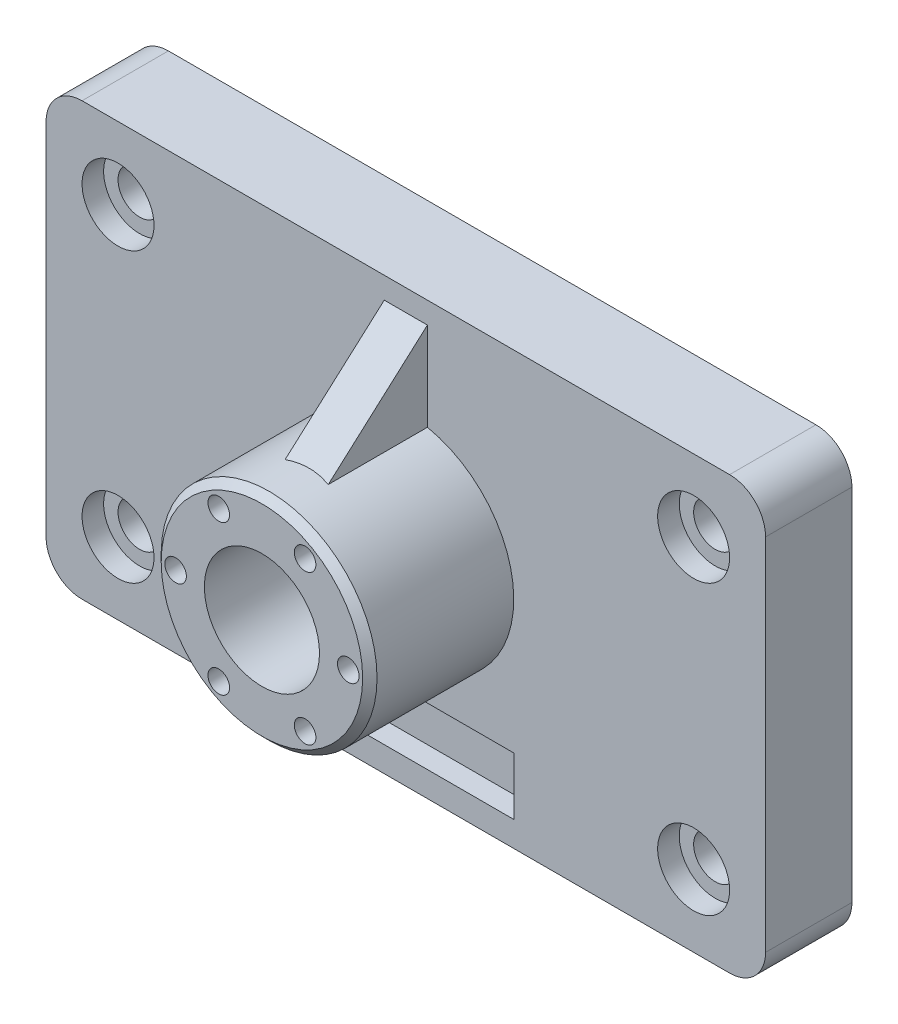
ISO-10303-21;
HEADER;
FILE_DESCRIPTION(('STEP AP214'),'2;1');
FILE_NAME('part.step','',(''),(''),'','','');
FILE_SCHEMA(('AUTOMOTIVE_DESIGN { 1 0 10303 214 1 1 1 1 }'));
ENDSEC;
DATA;
#1=APPLICATION_CONTEXT('core data for automotive mechanical design processes');
#2=APPLICATION_PROTOCOL_DEFINITION('international standard','automotive_design',2000,#1);
#3=PRODUCT_CONTEXT('',#1,'mechanical');
#4=PRODUCT('Part','Part','',(#3));
#5=PRODUCT_RELATED_PRODUCT_CATEGORY('part','',(#4));
#6=PRODUCT_DEFINITION_FORMATION('','',#4);
#7=PRODUCT_DEFINITION_CONTEXT('part definition',#1,'design');
#8=PRODUCT_DEFINITION('design','',#6,#7);
#9=PRODUCT_DEFINITION_SHAPE('','',#8);
#10=(LENGTH_UNIT() NAMED_UNIT(*) SI_UNIT(.MILLI.,.METRE.));
#11=(NAMED_UNIT(*) PLANE_ANGLE_UNIT() SI_UNIT($,.RADIAN.));
#12=(NAMED_UNIT(*) SI_UNIT($,.STERADIAN.) SOLID_ANGLE_UNIT());
#13=UNCERTAINTY_MEASURE_WITH_UNIT(LENGTH_MEASURE(1.E-05),#10,'distance_accuracy_value','');
#14=(GEOMETRIC_REPRESENTATION_CONTEXT(3) GLOBAL_UNCERTAINTY_ASSIGNED_CONTEXT((#13)) GLOBAL_UNIT_ASSIGNED_CONTEXT((#10,
#11,#12)) REPRESENTATION_CONTEXT('',''));
#15=CARTESIAN_POINT('',(0.,0.,0.));
#16=DIRECTION('',(0.,0.,1.));
#17=DIRECTION('',(1.,0.,0.));
#18=AXIS2_PLACEMENT_3D('',#15,#16,#17);
#19=CARTESIAN_POINT('',(-50.,-30.,12.));
#20=DIRECTION('',(1.,0.,0.));
#21=DIRECTION('',(0.,0.,-1.));
#22=AXIS2_PLACEMENT_3D('',#19,#20,#21);
#23=PLANE('',#22);
#24=DIRECTION('',(0.,-1.,0.));
#25=VECTOR('',#24,1.);
#26=CARTESIAN_POINT('',(-50.,-30.,12.));
#27=LINE('',#26,#25);
#28=CARTESIAN_POINT('',(-50.,25.,12.));
#29=VERTEX_POINT('',#28);
#30=CARTESIAN_POINT('',(-50.,-25.,12.));
#31=VERTEX_POINT('',#30);
#32=EDGE_CURVE('E290',#29,#31,#27,.T.);
#33=ORIENTED_EDGE('',*,*,#32,.F.);
#34=DIRECTION('',(0.,0.,-1.));
#35=VECTOR('',#34,1.);
#36=CARTESIAN_POINT('',(-50.,25.,12.));
#37=LINE('',#36,#35);
#38=CARTESIAN_POINT('',(-50.,25.,0.));
#39=VERTEX_POINT('',#38);
#40=EDGE_CURVE('E312',#29,#39,#37,.T.);
#41=ORIENTED_EDGE('',*,*,#40,.T.);
#42=DIRECTION('',(0.,-1.,0.));
#43=VECTOR('',#42,1.);
#44=CARTESIAN_POINT('',(-50.,-30.,0.));
#45=LINE('',#44,#43);
#46=CARTESIAN_POINT('',(-50.,-25.,0.));
#47=VERTEX_POINT('',#46);
#48=EDGE_CURVE('E284',#39,#47,#45,.T.);
#49=ORIENTED_EDGE('',*,*,#48,.T.);
#50=DIRECTION('',(0.,0.,-1.));
#51=VECTOR('',#50,1.);
#52=CARTESIAN_POINT('',(-50.,-25.,12.));
#53=LINE('',#52,#51);
#54=EDGE_CURVE('E302',#47,#31,#53,.F.);
#55=ORIENTED_EDGE('',*,*,#54,.T.);
#56=EDGE_LOOP('',(#33,#41,#49,#55));
#57=FACE_BOUND('',#56,.T.);
#58=ADVANCED_FACE('F41',(#57),#23,.F.);
#59=CARTESIAN_POINT('',(-50.,-30.,12.));
#60=DIRECTION('',(0.,1.,0.));
#61=DIRECTION('',(0.,0.,1.));
#62=AXIS2_PLACEMENT_3D('',#59,#60,#61);
#63=PLANE('',#62);
#64=DIRECTION('',(0.,0.,-1.));
#65=VECTOR('',#64,1.);
#66=CARTESIAN_POINT('',(45.,-30.,12.));
#67=LINE('',#66,#65);
#68=CARTESIAN_POINT('',(45.,-30.,0.));
#69=VERTEX_POINT('',#68);
#70=CARTESIAN_POINT('',(45.,-30.,12.));
#71=VERTEX_POINT('',#70);
#72=EDGE_CURVE('E289',#69,#71,#67,.F.);
#73=ORIENTED_EDGE('',*,*,#72,.T.);
#74=DIRECTION('',(1.,0.,0.));
#75=VECTOR('',#74,1.);
#76=CARTESIAN_POINT('',(-50.,-30.,12.));
#77=LINE('',#76,#75);
#78=CARTESIAN_POINT('',(-45.,-30.,12.));
#79=VERTEX_POINT('',#78);
#80=EDGE_CURVE('E293',#79,#71,#77,.T.);
#81=ORIENTED_EDGE('',*,*,#80,.F.);
#82=DIRECTION('',(0.,0.,-1.));
#83=VECTOR('',#82,1.);
#84=CARTESIAN_POINT('',(-45.,-30.,12.));
#85=LINE('',#84,#83);
#86=CARTESIAN_POINT('',(-45.,-30.,0.));
#87=VERTEX_POINT('',#86);
#88=EDGE_CURVE('E343',#79,#87,#85,.T.);
#89=ORIENTED_EDGE('',*,*,#88,.T.);
#90=DIRECTION('',(1.,0.,0.));
#91=VECTOR('',#90,1.);
#92=CARTESIAN_POINT('',(-50.,-30.,0.));
#93=LINE('',#92,#91);
#94=EDGE_CURVE('E305',#87,#69,#93,.T.);
#95=ORIENTED_EDGE('',*,*,#94,.T.);
#96=EDGE_LOOP('',(#73,#81,#89,#95));
#97=FACE_BOUND('',#96,.T.);
#98=ADVANCED_FACE('F396',(#97),#63,.F.);
#99=CARTESIAN_POINT('',(50.,-30.,12.));
#100=DIRECTION('',(-1.,0.,0.));
#101=DIRECTION('',(0.,0.,1.));
#102=AXIS2_PLACEMENT_3D('',#99,#100,#101);
#103=PLANE('',#102);
#104=DIRECTION('',(0.,1.,0.));
#105=VECTOR('',#104,1.);
#106=CARTESIAN_POINT('',(50.,-30.,0.));
#107=LINE('',#106,#105);
#108=CARTESIAN_POINT('',(50.,-25.,0.));
#109=VERTEX_POINT('',#108);
#110=CARTESIAN_POINT('',(50.,25.,0.));
#111=VERTEX_POINT('',#110);
#112=EDGE_CURVE('E307',#109,#111,#107,.T.);
#113=ORIENTED_EDGE('',*,*,#112,.T.);
#114=DIRECTION('',(0.,0.,-1.));
#115=VECTOR('',#114,1.);
#116=CARTESIAN_POINT('',(50.,25.,12.));
#117=LINE('',#116,#115);
#118=CARTESIAN_POINT('',(50.,25.,12.));
#119=VERTEX_POINT('',#118);
#120=EDGE_CURVE('E341',#111,#119,#117,.F.);
#121=ORIENTED_EDGE('',*,*,#120,.T.);
#122=DIRECTION('',(0.,1.,0.));
#123=VECTOR('',#122,1.);
#124=CARTESIAN_POINT('',(50.,-30.,12.));
#125=LINE('',#124,#123);
#126=CARTESIAN_POINT('',(50.,-25.,12.));
#127=VERTEX_POINT('',#126);
#128=EDGE_CURVE('E296',#127,#119,#125,.T.);
#129=ORIENTED_EDGE('',*,*,#128,.F.);
#130=DIRECTION('',(0.,0.,-1.));
#131=VECTOR('',#130,1.);
#132=CARTESIAN_POINT('',(50.,-25.,12.));
#133=LINE('',#132,#131);
#134=EDGE_CURVE('E338',#127,#109,#133,.T.);
#135=ORIENTED_EDGE('',*,*,#134,.T.);
#136=EDGE_LOOP('',(#113,#121,#129,#135));
#137=FACE_BOUND('',#136,.T.);
#138=ADVANCED_FACE('F403',(#137),#103,.F.);
#139=CARTESIAN_POINT('',(-50.,30.,12.));
#140=DIRECTION('',(0.,-1.,0.));
#141=DIRECTION('',(0.,0.,-1.));
#142=AXIS2_PLACEMENT_3D('',#139,#140,#141);
#143=PLANE('',#142);
#144=DIRECTION('',(-1.,0.,0.));
#145=VECTOR('',#144,1.);
#146=CARTESIAN_POINT('',(-50.,30.,0.));
#147=LINE('',#146,#145);
#148=CARTESIAN_POINT('',(45.,30.,0.));
#149=VERTEX_POINT('',#148);
#150=CARTESIAN_POINT('',(-45.,30.,0.));
#151=VERTEX_POINT('',#150);
#152=EDGE_CURVE('E294',#149,#151,#147,.T.);
#153=ORIENTED_EDGE('',*,*,#152,.T.);
#154=DIRECTION('',(0.,0.,-1.));
#155=VECTOR('',#154,1.);
#156=CARTESIAN_POINT('',(-45.,30.,12.));
#157=LINE('',#156,#155);
#158=CARTESIAN_POINT('',(-45.,30.,12.));
#159=VERTEX_POINT('',#158);
#160=EDGE_CURVE('E328',#151,#159,#157,.F.);
#161=ORIENTED_EDGE('',*,*,#160,.T.);
#162=DIRECTION('',(-1.,0.,0.));
#163=VECTOR('',#162,1.);
#164=CARTESIAN_POINT('',(-50.,30.,12.));
#165=LINE('',#164,#163);
#166=CARTESIAN_POINT('',(45.,30.,12.));
#167=VERTEX_POINT('',#166);
#168=EDGE_CURVE('E299',#167,#159,#165,.T.);
#169=ORIENTED_EDGE('',*,*,#168,.F.);
#170=DIRECTION('',(0.,0.,-1.));
#171=VECTOR('',#170,1.);
#172=CARTESIAN_POINT('',(45.,30.,12.));
#173=LINE('',#172,#171);
#174=EDGE_CURVE('E325',#167,#149,#173,.T.);
#175=ORIENTED_EDGE('',*,*,#174,.T.);
#176=EDGE_LOOP('',(#153,#161,#169,#175));
#177=FACE_BOUND('',#176,.T.);
#178=ADVANCED_FACE('F381',(#177),#143,.F.);
#179=CARTESIAN_POINT('',(0.,0.,12.));
#180=DIRECTION('',(0.,0.,-1.));
#181=DIRECTION('',(-1.,0.,0.));
#182=AXIS2_PLACEMENT_3D('',#179,#180,#181);
#183=PLANE('',#182);
#184=DIRECTION('',(0.,-1.,0.));
#185=VECTOR('',#184,1.);
#186=CARTESIAN_POINT('',(-15.,-18.5,12.));
#187=LINE('',#186,#185);
#188=CARTESIAN_POINT('',(-15.,-18.5,12.));
#189=VERTEX_POINT('',#188);
#190=CARTESIAN_POINT('',(-15.,-26.5,12.));
#191=VERTEX_POINT('',#190);
#192=EDGE_CURVE('E211',#189,#191,#187,.T.);
#193=ORIENTED_EDGE('',*,*,#192,.F.);
#194=DIRECTION('',(-1.,0.,0.));
#195=VECTOR('',#194,1.);
#196=CARTESIAN_POINT('',(15.,-18.5,12.));
#197=LINE('',#196,#195);
#198=CARTESIAN_POINT('',(15.,-18.5,12.));
#199=VERTEX_POINT('',#198);
#200=EDGE_CURVE('E218',#199,#189,#197,.T.);
#201=ORIENTED_EDGE('',*,*,#200,.F.);
#202=DIRECTION('',(0.,1.,0.));
#203=VECTOR('',#202,1.);
#204=CARTESIAN_POINT('',(15.,-26.5,12.));
#205=LINE('',#204,#203);
#206=CARTESIAN_POINT('',(15.,-26.5,12.));
#207=VERTEX_POINT('',#206);
#208=EDGE_CURVE('E229',#207,#199,#205,.T.);
#209=ORIENTED_EDGE('',*,*,#208,.F.);
#210=DIRECTION('',(1.,0.,0.));
#211=VECTOR('',#210,1.);
#212=CARTESIAN_POINT('',(-15.,-26.5,12.));
#213=LINE('',#212,#211);
#214=EDGE_CURVE('E227',#191,#207,#213,.T.);
#215=ORIENTED_EDGE('',*,*,#214,.F.);
#216=EDGE_LOOP('',(#193,#201,#209,#215));
#217=FACE_BOUND('',#216,.T.);
#218=ORIENTED_EDGE('',*,*,#80,.T.);
#219=CARTESIAN_POINT('',(45.,-25.,12.));
#220=DIRECTION('',(0.,0.,-1.));
#221=DIRECTION('',(-1.,0.,0.));
#222=AXIS2_PLACEMENT_3D('',#219,#220,#221);
#223=CIRCLE('',#222,5.);
#224=EDGE_CURVE('E332',#71,#127,#223,.F.);
#225=ORIENTED_EDGE('',*,*,#224,.T.);
#226=ORIENTED_EDGE('',*,*,#128,.T.);
#227=CARTESIAN_POINT('',(45.,25.,12.));
#228=DIRECTION('',(0.,0.,-1.));
#229=DIRECTION('',(-1.,0.,0.));
#230=AXIS2_PLACEMENT_3D('',#227,#228,#229);
#231=CIRCLE('',#230,5.);
#232=EDGE_CURVE('E334',#119,#167,#231,.F.);
#233=ORIENTED_EDGE('',*,*,#232,.T.);
#234=ORIENTED_EDGE('',*,*,#168,.T.);
#235=CARTESIAN_POINT('',(-45.,25.,12.));
#236=DIRECTION('',(0.,0.,-1.));
#237=DIRECTION('',(-1.,0.,0.));
#238=AXIS2_PLACEMENT_3D('',#235,#236,#237);
#239=CIRCLE('',#238,5.);
#240=EDGE_CURVE('E336',#159,#29,#239,.F.);
#241=ORIENTED_EDGE('',*,*,#240,.T.);
#242=ORIENTED_EDGE('',*,*,#32,.T.);
#243=CARTESIAN_POINT('',(-45.,-25.,12.));
#244=DIRECTION('',(0.,0.,-1.));
#245=DIRECTION('',(-1.,0.,0.));
#246=AXIS2_PLACEMENT_3D('',#243,#244,#245);
#247=CIRCLE('',#246,5.);
#248=EDGE_CURVE('E330',#31,#79,#247,.F.);
#249=ORIENTED_EDGE('',*,*,#248,.T.);
#250=EDGE_LOOP('',(#218,#225,#226,#233,#234,#241,#242,#249));
#251=FACE_BOUND('',#250,.T.);
#252=CARTESIAN_POINT('',(-40.,20.,12.));
#253=DIRECTION('',(0.,0.,1.));
#254=DIRECTION('',(1.,0.,0.));
#255=AXIS2_PLACEMENT_3D('',#252,#253,#254);
#256=CIRCLE('',#255,5.);
#257=CARTESIAN_POINT('',(-35.,20.,12.));
#258=VERTEX_POINT('',#257);
#259=EDGE_CURVE('E263',#258,#258,#256,.T.);
#260=ORIENTED_EDGE('',*,*,#259,.F.);
#261=EDGE_LOOP('',(#260));
#262=FACE_BOUND('',#261,.T.);
#263=CARTESIAN_POINT('',(40.,-20.,12.));
#264=DIRECTION('',(0.,0.,1.));
#265=DIRECTION('',(1.,0.,0.));
#266=AXIS2_PLACEMENT_3D('',#263,#264,#265);
#267=CIRCLE('',#266,5.);
#268=CARTESIAN_POINT('',(45.,-20.,12.));
#269=VERTEX_POINT('',#268);
#270=EDGE_CURVE('E270',#269,#269,#267,.T.);
#271=ORIENTED_EDGE('',*,*,#270,.F.);
#272=EDGE_LOOP('',(#271));
#273=FACE_BOUND('',#272,.T.);
#274=CARTESIAN_POINT('',(40.,20.,12.));
#275=DIRECTION('',(0.,0.,1.));
#276=DIRECTION('',(1.,0.,0.));
#277=AXIS2_PLACEMENT_3D('',#274,#275,#276);
#278=CIRCLE('',#277,5.);
#279=CARTESIAN_POINT('',(45.,20.,12.));
#280=VERTEX_POINT('',#279);
#281=EDGE_CURVE('E256',#280,#280,#278,.T.);
#282=ORIENTED_EDGE('',*,*,#281,.F.);
#283=EDGE_LOOP('',(#282));
#284=FACE_BOUND('',#283,.T.);
#285=CARTESIAN_POINT('',(-40.,-20.,12.));
#286=DIRECTION('',(0.,0.,1.));
#287=DIRECTION('',(1.,0.,0.));
#288=AXIS2_PLACEMENT_3D('',#285,#286,#287);
#289=CIRCLE('',#288,5.);
#290=CARTESIAN_POINT('',(-35.,-20.,12.));
#291=VERTEX_POINT('',#290);
#292=EDGE_CURVE('E266',#291,#291,#289,.T.);
#293=ORIENTED_EDGE('',*,*,#292,.F.);
#294=EDGE_LOOP('',(#293));
#295=FACE_BOUND('',#294,.T.);
#296=DIRECTION('',(0.,-1.,0.));
#297=VECTOR('',#296,1.);
#298=CARTESIAN_POINT('',(3.,0.,12.));
#299=LINE('',#298,#297);
#300=CARTESIAN_POINT('',(3.,27.,12.));
#301=VERTEX_POINT('',#300);
#302=CARTESIAN_POINT('',(3.,14.6969384566991,12.));
#303=VERTEX_POINT('',#302);
#304=EDGE_CURVE('E161',#301,#303,#299,.T.);
#305=ORIENTED_EDGE('',*,*,#304,.T.);
#306=CARTESIAN_POINT('',(0.,0.,12.));
#307=DIRECTION('',(0.,0.,1.));
#308=DIRECTION('',(1.,0.,0.));
#309=AXIS2_PLACEMENT_3D('',#306,#307,#308);
#310=CIRCLE('',#309,15.);
#311=CARTESIAN_POINT('',(-3.,14.6969384566991,12.));
#312=VERTEX_POINT('',#311);
#313=EDGE_CURVE('E287',#312,#303,#310,.T.);
#314=ORIENTED_EDGE('',*,*,#313,.F.);
#315=DIRECTION('',(0.,-1.,0.));
#316=VECTOR('',#315,1.);
#317=CARTESIAN_POINT('',(-3.,0.,12.));
#318=LINE('',#317,#316);
#319=CARTESIAN_POINT('',(-3.,27.,12.));
#320=VERTEX_POINT('',#319);
#321=EDGE_CURVE('E64',#320,#312,#318,.T.);
#322=ORIENTED_EDGE('',*,*,#321,.F.);
#323=DIRECTION('',(1.,0.,0.));
#324=VECTOR('',#323,1.);
#325=CARTESIAN_POINT('',(0.,27.,12.));
#326=LINE('',#325,#324);
#327=EDGE_CURVE('E59',#320,#301,#326,.T.);
#328=ORIENTED_EDGE('',*,*,#327,.T.);
#329=EDGE_LOOP('',(#305,#314,#322,#328));
#330=FACE_BOUND('',#329,.T.);
#331=ADVANCED_FACE('F378',(#217,#251,#262,#273,#284,#295,#330),#183,.F.);
#332=CARTESIAN_POINT('',(0.,0.,0.));
#333=DIRECTION('',(0.,0.,-1.));
#334=DIRECTION('',(-1.,0.,0.));
#335=AXIS2_PLACEMENT_3D('',#332,#333,#334);
#336=PLANE('',#335);
#337=CARTESIAN_POINT('',(0.,0.,0.));
#338=DIRECTION('',(0.,0.,1.));
#339=DIRECTION('',(1.,0.,0.));
#340=AXIS2_PLACEMENT_3D('',#337,#338,#339);
#341=CIRCLE('',#340,8.);
#342=CARTESIAN_POINT('',(8.,0.,0.));
#343=VERTEX_POINT('',#342);
#344=EDGE_CURVE('E281',#343,#343,#341,.T.);
#345=ORIENTED_EDGE('',*,*,#344,.T.);
#346=EDGE_LOOP('',(#345));
#347=FACE_BOUND('',#346,.T.);
#348=CARTESIAN_POINT('',(-45.,25.,0.));
#349=DIRECTION('',(0.,0.,-1.));
#350=DIRECTION('',(-1.,0.,0.));
#351=AXIS2_PLACEMENT_3D('',#348,#349,#350);
#352=CIRCLE('',#351,5.);
#353=EDGE_CURVE('E322',#39,#151,#352,.T.);
#354=ORIENTED_EDGE('',*,*,#353,.T.);
#355=ORIENTED_EDGE('',*,*,#152,.F.);
#356=CARTESIAN_POINT('',(45.,25.,0.));
#357=DIRECTION('',(0.,0.,-1.));
#358=DIRECTION('',(-1.,0.,0.));
#359=AXIS2_PLACEMENT_3D('',#356,#357,#358);
#360=CIRCLE('',#359,5.);
#361=EDGE_CURVE('E320',#149,#111,#360,.T.);
#362=ORIENTED_EDGE('',*,*,#361,.T.);
#363=ORIENTED_EDGE('',*,*,#112,.F.);
#364=CARTESIAN_POINT('',(45.,-25.,0.));
#365=DIRECTION('',(0.,0.,-1.));
#366=DIRECTION('',(-1.,0.,0.));
#367=AXIS2_PLACEMENT_3D('',#364,#365,#366);
#368=CIRCLE('',#367,5.);
#369=EDGE_CURVE('E317',#109,#69,#368,.T.);
#370=ORIENTED_EDGE('',*,*,#369,.T.);
#371=ORIENTED_EDGE('',*,*,#94,.F.);
#372=CARTESIAN_POINT('',(-45.,-25.,0.));
#373=DIRECTION('',(0.,0.,-1.));
#374=DIRECTION('',(-1.,0.,0.));
#375=AXIS2_PLACEMENT_3D('',#372,#373,#374);
#376=CIRCLE('',#375,5.);
#377=EDGE_CURVE('E315',#87,#47,#376,.T.);
#378=ORIENTED_EDGE('',*,*,#377,.T.);
#379=ORIENTED_EDGE('',*,*,#48,.F.);
#380=EDGE_LOOP('',(#354,#355,#362,#363,#370,#371,#378,#379));
#381=FACE_BOUND('',#380,.T.);
#382=CARTESIAN_POINT('',(40.,-20.,0.));
#383=DIRECTION('',(0.,0.,1.));
#384=DIRECTION('',(1.,0.,0.));
#385=AXIS2_PLACEMENT_3D('',#382,#383,#384);
#386=CIRCLE('',#385,3.);
#387=CARTESIAN_POINT('',(43.,-20.,0.));
#388=VERTEX_POINT('',#387);
#389=EDGE_CURVE('E246',#388,#388,#386,.T.);
#390=ORIENTED_EDGE('',*,*,#389,.T.);
#391=EDGE_LOOP('',(#390));
#392=FACE_BOUND('',#391,.T.);
#393=CARTESIAN_POINT('',(40.,20.,0.));
#394=DIRECTION('',(0.,0.,1.));
#395=DIRECTION('',(1.,0.,0.));
#396=AXIS2_PLACEMENT_3D('',#393,#394,#395);
#397=CIRCLE('',#396,3.);
#398=CARTESIAN_POINT('',(43.,20.,0.));
#399=VERTEX_POINT('',#398);
#400=EDGE_CURVE('E236',#399,#399,#397,.T.);
#401=ORIENTED_EDGE('',*,*,#400,.T.);
#402=EDGE_LOOP('',(#401));
#403=FACE_BOUND('',#402,.T.);
#404=CARTESIAN_POINT('',(-40.,-20.,0.));
#405=DIRECTION('',(0.,0.,1.));
#406=DIRECTION('',(1.,0.,0.));
#407=AXIS2_PLACEMENT_3D('',#404,#405,#406);
#408=CIRCLE('',#407,3.);
#409=CARTESIAN_POINT('',(-37.,-20.,0.));
#410=VERTEX_POINT('',#409);
#411=EDGE_CURVE('E250',#410,#410,#408,.T.);
#412=ORIENTED_EDGE('',*,*,#411,.T.);
#413=EDGE_LOOP('',(#412));
#414=FACE_BOUND('',#413,.T.);
#415=CARTESIAN_POINT('',(-40.,20.,0.));
#416=DIRECTION('',(0.,0.,1.));
#417=DIRECTION('',(1.,0.,0.));
#418=AXIS2_PLACEMENT_3D('',#415,#416,#417);
#419=CIRCLE('',#418,3.);
#420=CARTESIAN_POINT('',(-37.,20.,0.));
#421=VERTEX_POINT('',#420);
#422=EDGE_CURVE('E247',#421,#421,#419,.T.);
#423=ORIENTED_EDGE('',*,*,#422,.T.);
#424=EDGE_LOOP('',(#423));
#425=FACE_BOUND('',#424,.T.);
#426=ADVANCED_FACE('F380',(#347,#381,#392,#403,#414,#425),#336,.T.);
#427=CARTESIAN_POINT('',(-45.,25.,12.));
#428=DIRECTION('',(0.,0.,-1.));
#429=DIRECTION('',(-1.,0.,0.));
#430=AXIS2_PLACEMENT_3D('',#427,#428,#429);
#431=CYLINDRICAL_SURFACE('',#430,5.);
#432=ORIENTED_EDGE('',*,*,#240,.F.);
#433=ORIENTED_EDGE('',*,*,#160,.F.);
#434=ORIENTED_EDGE('',*,*,#353,.F.);
#435=ORIENTED_EDGE('',*,*,#40,.F.);
#436=EDGE_LOOP('',(#432,#433,#434,#435));
#437=FACE_BOUND('',#436,.T.);
#438=ADVANCED_FACE('F409',(#437),#431,.T.);
#439=CARTESIAN_POINT('',(45.,25.,12.));
#440=DIRECTION('',(0.,0.,-1.));
#441=DIRECTION('',(-1.,0.,0.));
#442=AXIS2_PLACEMENT_3D('',#439,#440,#441);
#443=CYLINDRICAL_SURFACE('',#442,5.);
#444=ORIENTED_EDGE('',*,*,#232,.F.);
#445=ORIENTED_EDGE('',*,*,#120,.F.);
#446=ORIENTED_EDGE('',*,*,#361,.F.);
#447=ORIENTED_EDGE('',*,*,#174,.F.);
#448=EDGE_LOOP('',(#444,#445,#446,#447));
#449=FACE_BOUND('',#448,.T.);
#450=ADVANCED_FACE('F412',(#449),#443,.T.);
#451=CARTESIAN_POINT('',(45.,-25.,12.));
#452=DIRECTION('',(0.,0.,-1.));
#453=DIRECTION('',(-1.,0.,0.));
#454=AXIS2_PLACEMENT_3D('',#451,#452,#453);
#455=CYLINDRICAL_SURFACE('',#454,5.);
#456=ORIENTED_EDGE('',*,*,#224,.F.);
#457=ORIENTED_EDGE('',*,*,#72,.F.);
#458=ORIENTED_EDGE('',*,*,#369,.F.);
#459=ORIENTED_EDGE('',*,*,#134,.F.);
#460=EDGE_LOOP('',(#456,#457,#458,#459));
#461=FACE_BOUND('',#460,.T.);
#462=ADVANCED_FACE('F416',(#461),#455,.T.);
#463=CARTESIAN_POINT('',(-45.,-25.,12.));
#464=DIRECTION('',(0.,0.,-1.));
#465=DIRECTION('',(-1.,0.,0.));
#466=AXIS2_PLACEMENT_3D('',#463,#464,#465);
#467=CYLINDRICAL_SURFACE('',#466,5.);
#468=ORIENTED_EDGE('',*,*,#248,.F.);
#469=ORIENTED_EDGE('',*,*,#54,.F.);
#470=ORIENTED_EDGE('',*,*,#377,.F.);
#471=ORIENTED_EDGE('',*,*,#88,.F.);
#472=EDGE_LOOP('',(#468,#469,#470,#471));
#473=FACE_BOUND('',#472,.T.);
#474=ADVANCED_FACE('F419',(#473),#467,.T.);
#475=CARTESIAN_POINT('',(0.,0.,32.));
#476=DIRECTION('',(0.,0.,-1.));
#477=DIRECTION('',(-1.,0.,0.));
#478=AXIS2_PLACEMENT_3D('',#475,#476,#477);
#479=CYLINDRICAL_SURFACE('',#478,15.);
#480=ORIENTED_EDGE('',*,*,#313,.T.);
#481=DIRECTION('',(0.,0.,-1.));
#482=VECTOR('',#481,1.);
#483=CARTESIAN_POINT('',(3.,14.6969384566991,32.));
#484=LINE('',#483,#482);
#485=CARTESIAN_POINT('',(3.,14.6969384566991,25.7794289284971));
#486=VERTEX_POINT('',#485);
#487=EDGE_CURVE('E156',#303,#486,#484,.F.);
#488=ORIENTED_EDGE('',*,*,#487,.T.);
#489=CARTESIAN_POINT('',(0.,0.,42.24));
#490=DIRECTION('',(0.,0.745937661625915,0.666015769308852));
#491=DIRECTION('',(0.,0.666015769308852,-0.745937661625915));
#492=AXIS2_PLACEMENT_3D('',#489,#490,#491);
#493=ELLIPSE('',#492,22.5219892549481,15.);
#494=CARTESIAN_POINT('',(-3.,14.6969384566991,25.779428928497));
#495=VERTEX_POINT('',#494);
#496=EDGE_CURVE('E150',#486,#495,#493,.T.);
#497=ORIENTED_EDGE('',*,*,#496,.T.);
#498=DIRECTION('',(0.,0.,-1.));
#499=VECTOR('',#498,1.);
#500=CARTESIAN_POINT('',(-3.,14.6969384566991,32.));
#501=LINE('',#500,#499);
#502=EDGE_CURVE('E154',#312,#495,#501,.F.);
#503=ORIENTED_EDGE('',*,*,#502,.F.);
#504=EDGE_LOOP('',(#480,#488,#497,#503));
#505=FACE_BOUND('',#504,.T.);
#506=CARTESIAN_POINT('',(0.,0.,31.));
#507=DIRECTION('',(0.,0.,1.));
#508=DIRECTION('',(1.,0.,0.));
#509=AXIS2_PLACEMENT_3D('',#506,#507,#508);
#510=CIRCLE('',#509,15.);
#511=CARTESIAN_POINT('',(15.,0.,31.));
#512=VERTEX_POINT('',#511);
#513=EDGE_CURVE('E11',#512,#512,#510,.F.);
#514=ORIENTED_EDGE('',*,*,#513,.T.);
#515=EDGE_LOOP('',(#514));
#516=FACE_BOUND('',#515,.T.);
#517=ADVANCED_FACE('F152',(#505,#516),#479,.T.);
#518=CARTESIAN_POINT('',(0.,0.,32.));
#519=DIRECTION('',(0.,0.,1.));
#520=DIRECTION('',(1.,0.,0.));
#521=AXIS2_PLACEMENT_3D('',#518,#519,#520);
#522=PLANE('',#521);
#523=CARTESIAN_POINT('',(0.,0.,32.));
#524=DIRECTION('',(0.,0.,1.));
#525=DIRECTION('',(1.,0.,0.));
#526=AXIS2_PLACEMENT_3D('',#523,#524,#525);
#527=CIRCLE('',#526,8.);
#528=CARTESIAN_POINT('',(8.,0.,32.));
#529=VERTEX_POINT('',#528);
#530=EDGE_CURVE('E278',#529,#529,#527,.T.);
#531=ORIENTED_EDGE('',*,*,#530,.F.);
#532=EDGE_LOOP('',(#531));
#533=FACE_BOUND('',#532,.T.);
#534=CARTESIAN_POINT('',(0.,0.,32.));
#535=DIRECTION('',(0.,0.,1.));
#536=DIRECTION('',(1.,0.,0.));
#537=AXIS2_PLACEMENT_3D('',#534,#535,#536);
#538=CIRCLE('',#537,14.);
#539=CARTESIAN_POINT('',(14.,0.,32.));
#540=VERTEX_POINT('',#539);
#541=EDGE_CURVE('E51',#540,#540,#538,.T.);
#542=ORIENTED_EDGE('',*,*,#541,.T.);
#543=EDGE_LOOP('',(#542));
#544=FACE_BOUND('',#543,.T.);
#545=CARTESIAN_POINT('',(5.99999999999999,-10.3923048454133,32.));
#546=DIRECTION('',(0.,0.,1.));
#547=DIRECTION('',(0.499999999999999,-0.866025403784439,0.));
#548=AXIS2_PLACEMENT_3D('',#545,#546,#547);
#549=CIRCLE('',#548,1.5);
#550=CARTESIAN_POINT('',(6.74999999999999,-11.6913429510899,32.));
#551=VERTEX_POINT('',#550);
#552=EDGE_CURVE('E177',#551,#551,#549,.T.);
#553=ORIENTED_EDGE('',*,*,#552,.F.);
#554=EDGE_LOOP('',(#553));
#555=FACE_BOUND('',#554,.T.);
#556=CARTESIAN_POINT('',(-6.00000000000001,-10.3923048454133,32.));
#557=DIRECTION('',(0.,0.,1.));
#558=DIRECTION('',(-0.5,-0.866025403784438,0.));
#559=AXIS2_PLACEMENT_3D('',#556,#557,#558);
#560=CIRCLE('',#559,1.5);
#561=CARTESIAN_POINT('',(-6.75000000000001,-11.6913429510899,32.));
#562=VERTEX_POINT('',#561);
#563=EDGE_CURVE('E194',#562,#562,#560,.T.);
#564=ORIENTED_EDGE('',*,*,#563,.F.);
#565=EDGE_LOOP('',(#564));
#566=FACE_BOUND('',#565,.T.);
#567=CARTESIAN_POINT('',(-12.,0.,32.));
#568=DIRECTION('',(0.,0.,1.));
#569=DIRECTION('',(-1.,0.,0.));
#570=AXIS2_PLACEMENT_3D('',#567,#568,#569);
#571=CIRCLE('',#570,1.5);
#572=CARTESIAN_POINT('',(-13.5,0.,32.));
#573=VERTEX_POINT('',#572);
#574=EDGE_CURVE('E188',#573,#573,#571,.T.);
#575=ORIENTED_EDGE('',*,*,#574,.F.);
#576=EDGE_LOOP('',(#575));
#577=FACE_BOUND('',#576,.T.);
#578=CARTESIAN_POINT('',(-6.,10.3923048454133,32.));
#579=DIRECTION('',(0.,0.,1.));
#580=DIRECTION('',(-0.5,0.866025403784439,0.));
#581=AXIS2_PLACEMENT_3D('',#578,#579,#580);
#582=CIRCLE('',#581,1.5);
#583=CARTESIAN_POINT('',(-6.75,11.6913429510899,32.));
#584=VERTEX_POINT('',#583);
#585=EDGE_CURVE('E182',#584,#584,#582,.T.);
#586=ORIENTED_EDGE('',*,*,#585,.F.);
#587=EDGE_LOOP('',(#586));
#588=FACE_BOUND('',#587,.T.);
#589=CARTESIAN_POINT('',(6.,10.3923048454133,32.));
#590=DIRECTION('',(0.,0.,1.));
#591=DIRECTION('',(0.5,0.866025403784439,0.));
#592=AXIS2_PLACEMENT_3D('',#589,#590,#591);
#593=CIRCLE('',#592,1.5);
#594=CARTESIAN_POINT('',(6.75,11.6913429510899,32.));
#595=VERTEX_POINT('',#594);
#596=EDGE_CURVE('E181',#595,#595,#593,.T.);
#597=ORIENTED_EDGE('',*,*,#596,.F.);
#598=EDGE_LOOP('',(#597));
#599=FACE_BOUND('',#598,.T.);
#600=CARTESIAN_POINT('',(12.,0.,32.));
#601=DIRECTION('',(0.,0.,1.));
#602=DIRECTION('',(1.,0.,0.));
#603=AXIS2_PLACEMENT_3D('',#600,#601,#602);
#604=CIRCLE('',#603,1.5);
#605=CARTESIAN_POINT('',(13.5,0.,32.));
#606=VERTEX_POINT('',#605);
#607=EDGE_CURVE('E205',#606,#606,#604,.T.);
#608=ORIENTED_EDGE('',*,*,#607,.F.);
#609=EDGE_LOOP('',(#608));
#610=FACE_BOUND('',#609,.T.);
#611=ADVANCED_FACE('F426',(#533,#544,#555,#566,#577,#588,#599,#610),#522,.T.);
#612=CARTESIAN_POINT('',(0.,0.,32.));
#613=DIRECTION('',(0.,0.,-1.));
#614=DIRECTION('',(-1.,0.,0.));
#615=AXIS2_PLACEMENT_3D('',#612,#613,#614);
#616=CONICAL_SURFACE('',#615,14.,0.785398163397445);
#617=ORIENTED_EDGE('',*,*,#541,.F.);
#618=EDGE_LOOP('',(#617));
#619=FACE_BOUND('',#618,.T.);
#620=ORIENTED_EDGE('',*,*,#513,.F.);
#621=EDGE_LOOP('',(#620));
#622=FACE_BOUND('',#621,.T.);
#623=ADVANCED_FACE('F44',(#619,#622),#616,.T.);
#624=CARTESIAN_POINT('',(0.,0.,0.));
#625=DIRECTION('',(0.,0.,1.));
#626=DIRECTION('',(1.,0.,0.));
#627=AXIS2_PLACEMENT_3D('',#624,#625,#626);
#628=CYLINDRICAL_SURFACE('',#627,8.);
#629=ORIENTED_EDGE('',*,*,#344,.F.);
#630=EDGE_LOOP('',(#629));
#631=FACE_BOUND('',#630,.T.);
#632=ORIENTED_EDGE('',*,*,#530,.T.);
#633=EDGE_LOOP('',(#632));
#634=FACE_BOUND('',#633,.T.);
#635=ADVANCED_FACE('F374',(#631,#634),#628,.F.);
#636=CARTESIAN_POINT('',(-40.,-20.,9.));
#637=DIRECTION('',(0.,0.,1.));
#638=DIRECTION('',(1.,0.,0.));
#639=AXIS2_PLACEMENT_3D('',#636,#637,#638);
#640=CYLINDRICAL_SURFACE('',#639,5.);
#641=CARTESIAN_POINT('',(-40.,-20.,9.));
#642=DIRECTION('',(0.,0.,1.));
#643=DIRECTION('',(1.,0.,0.));
#644=AXIS2_PLACEMENT_3D('',#641,#642,#643);
#645=CIRCLE('',#644,5.);
#646=CARTESIAN_POINT('',(-35.,-20.,9.));
#647=VERTEX_POINT('',#646);
#648=EDGE_CURVE('E275',#647,#647,#645,.T.);
#649=ORIENTED_EDGE('',*,*,#648,.F.);
#650=EDGE_LOOP('',(#649));
#651=FACE_BOUND('',#650,.T.);
#652=ORIENTED_EDGE('',*,*,#292,.T.);
#653=EDGE_LOOP('',(#652));
#654=FACE_BOUND('',#653,.T.);
#655=ADVANCED_FACE('F368',(#651,#654),#640,.F.);
#656=CARTESIAN_POINT('',(-40.,-20.,9.));
#657=DIRECTION('',(0.,0.,1.));
#658=DIRECTION('',(1.,0.,0.));
#659=AXIS2_PLACEMENT_3D('',#656,#657,#658);
#660=PLANE('',#659);
#661=CARTESIAN_POINT('',(-40.,-20.,9.));
#662=DIRECTION('',(0.,0.,1.));
#663=DIRECTION('',(1.,0.,0.));
#664=AXIS2_PLACEMENT_3D('',#661,#662,#663);
#665=CIRCLE('',#664,3.);
#666=CARTESIAN_POINT('',(-37.,-20.,9.));
#667=VERTEX_POINT('',#666);
#668=EDGE_CURVE('E46',#667,#667,#665,.T.);
#669=ORIENTED_EDGE('',*,*,#668,.F.);
#670=EDGE_LOOP('',(#669));
#671=FACE_BOUND('',#670,.T.);
#672=ORIENTED_EDGE('',*,*,#648,.T.);
#673=EDGE_LOOP('',(#672));
#674=FACE_BOUND('',#673,.T.);
#675=ADVANCED_FACE('F364',(#671,#674),#660,.T.);
#676=CARTESIAN_POINT('',(40.,20.,9.));
#677=DIRECTION('',(0.,0.,1.));
#678=DIRECTION('',(1.,0.,0.));
#679=AXIS2_PLACEMENT_3D('',#676,#677,#678);
#680=CYLINDRICAL_SURFACE('',#679,5.);
#681=CARTESIAN_POINT('',(40.,20.,9.));
#682=DIRECTION('',(0.,0.,1.));
#683=DIRECTION('',(1.,0.,0.));
#684=AXIS2_PLACEMENT_3D('',#681,#682,#683);
#685=CIRCLE('',#684,5.);
#686=CARTESIAN_POINT('',(45.,20.,9.));
#687=VERTEX_POINT('',#686);
#688=EDGE_CURVE('E260',#687,#687,#685,.T.);
#689=ORIENTED_EDGE('',*,*,#688,.F.);
#690=EDGE_LOOP('',(#689));
#691=FACE_BOUND('',#690,.T.);
#692=ORIENTED_EDGE('',*,*,#281,.T.);
#693=EDGE_LOOP('',(#692));
#694=FACE_BOUND('',#693,.T.);
#695=ADVANCED_FACE('F367',(#691,#694),#680,.F.);
#696=CARTESIAN_POINT('',(40.,20.,9.));
#697=DIRECTION('',(0.,0.,1.));
#698=DIRECTION('',(1.,0.,0.));
#699=AXIS2_PLACEMENT_3D('',#696,#697,#698);
#700=PLANE('',#699);
#701=CARTESIAN_POINT('',(40.,20.,9.));
#702=DIRECTION('',(0.,0.,1.));
#703=DIRECTION('',(1.,0.,0.));
#704=AXIS2_PLACEMENT_3D('',#701,#702,#703);
#705=CIRCLE('',#704,3.);
#706=CARTESIAN_POINT('',(43.,20.,9.));
#707=VERTEX_POINT('',#706);
#708=EDGE_CURVE('E354',#707,#707,#705,.T.);
#709=ORIENTED_EDGE('',*,*,#708,.F.);
#710=EDGE_LOOP('',(#709));
#711=FACE_BOUND('',#710,.T.);
#712=ORIENTED_EDGE('',*,*,#688,.T.);
#713=EDGE_LOOP('',(#712));
#714=FACE_BOUND('',#713,.T.);
#715=ADVANCED_FACE('F488',(#711,#714),#700,.T.);
#716=CARTESIAN_POINT('',(40.,-20.,9.));
#717=DIRECTION('',(0.,0.,1.));
#718=DIRECTION('',(1.,0.,0.));
#719=AXIS2_PLACEMENT_3D('',#716,#717,#718);
#720=CYLINDRICAL_SURFACE('',#719,5.);
#721=CARTESIAN_POINT('',(40.,-20.,9.));
#722=DIRECTION('',(0.,0.,1.));
#723=DIRECTION('',(1.,0.,0.));
#724=AXIS2_PLACEMENT_3D('',#721,#722,#723);
#725=CIRCLE('',#724,5.);
#726=CARTESIAN_POINT('',(45.,-20.,9.));
#727=VERTEX_POINT('',#726);
#728=EDGE_CURVE('E259',#727,#727,#725,.T.);
#729=ORIENTED_EDGE('',*,*,#728,.F.);
#730=EDGE_LOOP('',(#729));
#731=FACE_BOUND('',#730,.T.);
#732=ORIENTED_EDGE('',*,*,#270,.T.);
#733=EDGE_LOOP('',(#732));
#734=FACE_BOUND('',#733,.T.);
#735=ADVANCED_FACE('F492',(#731,#734),#720,.F.);
#736=CARTESIAN_POINT('',(40.,-20.,9.));
#737=DIRECTION('',(0.,0.,1.));
#738=DIRECTION('',(1.,0.,0.));
#739=AXIS2_PLACEMENT_3D('',#736,#737,#738);
#740=PLANE('',#739);
#741=CARTESIAN_POINT('',(40.,-20.,9.));
#742=DIRECTION('',(0.,0.,1.));
#743=DIRECTION('',(1.,0.,0.));
#744=AXIS2_PLACEMENT_3D('',#741,#742,#743);
#745=CIRCLE('',#744,3.);
#746=CARTESIAN_POINT('',(43.,-20.,9.));
#747=VERTEX_POINT('',#746);
#748=EDGE_CURVE('E352',#747,#747,#745,.T.);
#749=ORIENTED_EDGE('',*,*,#748,.F.);
#750=EDGE_LOOP('',(#749));
#751=FACE_BOUND('',#750,.T.);
#752=ORIENTED_EDGE('',*,*,#728,.T.);
#753=EDGE_LOOP('',(#752));
#754=FACE_BOUND('',#753,.T.);
#755=ADVANCED_FACE('F495',(#751,#754),#740,.T.);
#756=CARTESIAN_POINT('',(-40.,20.,9.));
#757=DIRECTION('',(0.,0.,1.));
#758=DIRECTION('',(1.,0.,0.));
#759=AXIS2_PLACEMENT_3D('',#756,#757,#758);
#760=CYLINDRICAL_SURFACE('',#759,5.);
#761=CARTESIAN_POINT('',(-40.,20.,9.));
#762=DIRECTION('',(0.,0.,1.));
#763=DIRECTION('',(1.,0.,0.));
#764=AXIS2_PLACEMENT_3D('',#761,#762,#763);
#765=CIRCLE('',#764,5.);
#766=CARTESIAN_POINT('',(-35.,20.,9.));
#767=VERTEX_POINT('',#766);
#768=EDGE_CURVE('E267',#767,#767,#765,.T.);
#769=ORIENTED_EDGE('',*,*,#768,.F.);
#770=EDGE_LOOP('',(#769));
#771=FACE_BOUND('',#770,.T.);
#772=ORIENTED_EDGE('',*,*,#259,.T.);
#773=EDGE_LOOP('',(#772));
#774=FACE_BOUND('',#773,.T.);
#775=ADVANCED_FACE('F477',(#771,#774),#760,.F.);
#776=CARTESIAN_POINT('',(-40.,20.,9.));
#777=DIRECTION('',(0.,0.,1.));
#778=DIRECTION('',(1.,0.,0.));
#779=AXIS2_PLACEMENT_3D('',#776,#777,#778);
#780=PLANE('',#779);
#781=CARTESIAN_POINT('',(-40.,20.,9.));
#782=DIRECTION('',(0.,0.,1.));
#783=DIRECTION('',(1.,0.,0.));
#784=AXIS2_PLACEMENT_3D('',#781,#782,#783);
#785=CIRCLE('',#784,3.);
#786=CARTESIAN_POINT('',(-37.,20.,9.));
#787=VERTEX_POINT('',#786);
#788=EDGE_CURVE('E255',#787,#787,#785,.T.);
#789=ORIENTED_EDGE('',*,*,#788,.F.);
#790=EDGE_LOOP('',(#789));
#791=FACE_BOUND('',#790,.T.);
#792=ORIENTED_EDGE('',*,*,#768,.T.);
#793=EDGE_LOOP('',(#792));
#794=FACE_BOUND('',#793,.T.);
#795=ADVANCED_FACE('F467',(#791,#794),#780,.T.);
#796=CARTESIAN_POINT('',(-40.,20.,0.));
#797=DIRECTION('',(0.,0.,1.));
#798=DIRECTION('',(1.,0.,0.));
#799=AXIS2_PLACEMENT_3D('',#796,#797,#798);
#800=CYLINDRICAL_SURFACE('',#799,3.);
#801=ORIENTED_EDGE('',*,*,#788,.T.);
#802=EDGE_LOOP('',(#801));
#803=FACE_BOUND('',#802,.T.);
#804=ORIENTED_EDGE('',*,*,#422,.F.);
#805=EDGE_LOOP('',(#804));
#806=FACE_BOUND('',#805,.T.);
#807=ADVANCED_FACE('F464',(#803,#806),#800,.F.);
#808=CARTESIAN_POINT('',(40.,-20.,0.));
#809=DIRECTION('',(0.,0.,1.));
#810=DIRECTION('',(1.,0.,0.));
#811=AXIS2_PLACEMENT_3D('',#808,#809,#810);
#812=CYLINDRICAL_SURFACE('',#811,3.);
#813=ORIENTED_EDGE('',*,*,#748,.T.);
#814=EDGE_LOOP('',(#813));
#815=FACE_BOUND('',#814,.T.);
#816=ORIENTED_EDGE('',*,*,#389,.F.);
#817=EDGE_LOOP('',(#816));
#818=FACE_BOUND('',#817,.T.);
#819=ADVANCED_FACE('F466',(#815,#818),#812,.F.);
#820=CARTESIAN_POINT('',(40.,20.,0.));
#821=DIRECTION('',(0.,0.,1.));
#822=DIRECTION('',(1.,0.,0.));
#823=AXIS2_PLACEMENT_3D('',#820,#821,#822);
#824=CYLINDRICAL_SURFACE('',#823,3.);
#825=ORIENTED_EDGE('',*,*,#708,.T.);
#826=EDGE_LOOP('',(#825));
#827=FACE_BOUND('',#826,.T.);
#828=ORIENTED_EDGE('',*,*,#400,.F.);
#829=EDGE_LOOP('',(#828));
#830=FACE_BOUND('',#829,.T.);
#831=ADVANCED_FACE('F474',(#827,#830),#824,.F.);
#832=CARTESIAN_POINT('',(-40.,-20.,0.));
#833=DIRECTION('',(0.,0.,1.));
#834=DIRECTION('',(1.,0.,0.));
#835=AXIS2_PLACEMENT_3D('',#832,#833,#834);
#836=CYLINDRICAL_SURFACE('',#835,3.);
#837=ORIENTED_EDGE('',*,*,#668,.T.);
#838=EDGE_LOOP('',(#837));
#839=FACE_BOUND('',#838,.T.);
#840=ORIENTED_EDGE('',*,*,#411,.F.);
#841=EDGE_LOOP('',(#840));
#842=FACE_BOUND('',#841,.T.);
#843=ADVANCED_FACE('F361',(#839,#842),#836,.F.);
#844=CARTESIAN_POINT('',(-15.,-18.5,9.));
#845=DIRECTION('',(-1.,0.,0.));
#846=DIRECTION('',(0.,0.,1.));
#847=AXIS2_PLACEMENT_3D('',#844,#845,#846);
#848=PLANE('',#847);
#849=ORIENTED_EDGE('',*,*,#192,.T.);
#850=DIRECTION('',(0.,0.,1.));
#851=VECTOR('',#850,1.);
#852=CARTESIAN_POINT('',(-15.,-26.5,9.));
#853=LINE('',#852,#851);
#854=CARTESIAN_POINT('',(-15.,-26.5,9.));
#855=VERTEX_POINT('',#854);
#856=EDGE_CURVE('E225',#855,#191,#853,.T.);
#857=ORIENTED_EDGE('',*,*,#856,.F.);
#858=DIRECTION('',(0.,-1.,0.));
#859=VECTOR('',#858,1.);
#860=CARTESIAN_POINT('',(-15.,-18.5,9.));
#861=LINE('',#860,#859);
#862=CARTESIAN_POINT('',(-15.,-18.5,9.));
#863=VERTEX_POINT('',#862);
#864=EDGE_CURVE('E214',#863,#855,#861,.T.);
#865=ORIENTED_EDGE('',*,*,#864,.F.);
#866=DIRECTION('',(0.,0.,1.));
#867=VECTOR('',#866,1.);
#868=CARTESIAN_POINT('',(-15.,-18.5,9.));
#869=LINE('',#868,#867);
#870=EDGE_CURVE('E233',#863,#189,#869,.T.);
#871=ORIENTED_EDGE('',*,*,#870,.T.);
#872=EDGE_LOOP('',(#849,#857,#865,#871));
#873=FACE_BOUND('',#872,.T.);
#874=ADVANCED_FACE('F485',(#873),#848,.F.);
#875=CARTESIAN_POINT('',(15.,-18.5,9.));
#876=DIRECTION('',(0.,1.,0.));
#877=DIRECTION('',(0.,0.,1.));
#878=AXIS2_PLACEMENT_3D('',#875,#876,#877);
#879=PLANE('',#878);
#880=ORIENTED_EDGE('',*,*,#200,.T.);
#881=ORIENTED_EDGE('',*,*,#870,.F.);
#882=DIRECTION('',(-1.,0.,0.));
#883=VECTOR('',#882,1.);
#884=CARTESIAN_POINT('',(15.,-18.5,9.));
#885=LINE('',#884,#883);
#886=CARTESIAN_POINT('',(15.,-18.5,9.));
#887=VERTEX_POINT('',#886);
#888=EDGE_CURVE('E223',#887,#863,#885,.T.);
#889=ORIENTED_EDGE('',*,*,#888,.F.);
#890=DIRECTION('',(0.,0.,1.));
#891=VECTOR('',#890,1.);
#892=CARTESIAN_POINT('',(15.,-18.5,9.));
#893=LINE('',#892,#891);
#894=EDGE_CURVE('E237',#887,#199,#893,.T.);
#895=ORIENTED_EDGE('',*,*,#894,.T.);
#896=EDGE_LOOP('',(#880,#881,#889,#895));
#897=FACE_BOUND('',#896,.T.);
#898=ADVANCED_FACE('F643',(#897),#879,.F.);
#899=CARTESIAN_POINT('',(15.,-26.5,9.));
#900=DIRECTION('',(1.,0.,0.));
#901=DIRECTION('',(0.,0.,-1.));
#902=AXIS2_PLACEMENT_3D('',#899,#900,#901);
#903=PLANE('',#902);
#904=ORIENTED_EDGE('',*,*,#208,.T.);
#905=ORIENTED_EDGE('',*,*,#894,.F.);
#906=DIRECTION('',(0.,1.,0.));
#907=VECTOR('',#906,1.);
#908=CARTESIAN_POINT('',(15.,-26.5,9.));
#909=LINE('',#908,#907);
#910=CARTESIAN_POINT('',(15.,-26.5,9.));
#911=VERTEX_POINT('',#910);
#912=EDGE_CURVE('E220',#911,#887,#909,.T.);
#913=ORIENTED_EDGE('',*,*,#912,.F.);
#914=DIRECTION('',(0.,0.,1.));
#915=VECTOR('',#914,1.);
#916=CARTESIAN_POINT('',(15.,-26.5,9.));
#917=LINE('',#916,#915);
#918=EDGE_CURVE('E239',#911,#207,#917,.T.);
#919=ORIENTED_EDGE('',*,*,#918,.T.);
#920=EDGE_LOOP('',(#904,#905,#913,#919));
#921=FACE_BOUND('',#920,.T.);
#922=ADVANCED_FACE('F652',(#921),#903,.F.);
#923=CARTESIAN_POINT('',(-15.,-26.5,9.));
#924=DIRECTION('',(0.,-1.,0.));
#925=DIRECTION('',(0.,0.,-1.));
#926=AXIS2_PLACEMENT_3D('',#923,#924,#925);
#927=PLANE('',#926);
#928=ORIENTED_EDGE('',*,*,#918,.F.);
#929=DIRECTION('',(1.,0.,0.));
#930=VECTOR('',#929,1.);
#931=CARTESIAN_POINT('',(-15.,-26.5,9.));
#932=LINE('',#931,#930);
#933=EDGE_CURVE('E217',#855,#911,#932,.T.);
#934=ORIENTED_EDGE('',*,*,#933,.F.);
#935=ORIENTED_EDGE('',*,*,#856,.T.);
#936=ORIENTED_EDGE('',*,*,#214,.T.);
#937=EDGE_LOOP('',(#928,#934,#935,#936));
#938=FACE_BOUND('',#937,.T.);
#939=ADVANCED_FACE('F662',(#938),#927,.F.);
#940=CARTESIAN_POINT('',(0.,0.,9.));
#941=DIRECTION('',(0.,0.,1.));
#942=DIRECTION('',(1.,0.,0.));
#943=AXIS2_PLACEMENT_3D('',#940,#941,#942);
#944=PLANE('',#943);
#945=ORIENTED_EDGE('',*,*,#888,.T.);
#946=ORIENTED_EDGE('',*,*,#864,.T.);
#947=ORIENTED_EDGE('',*,*,#933,.T.);
#948=ORIENTED_EDGE('',*,*,#912,.T.);
#949=EDGE_LOOP('',(#945,#946,#947,#948));
#950=FACE_BOUND('',#949,.T.);
#951=ADVANCED_FACE('F672',(#950),#944,.T.);
#952=CARTESIAN_POINT('',(12.,0.,24.));
#953=DIRECTION('',(0.,0.,1.));
#954=DIRECTION('',(1.,0.,0.));
#955=AXIS2_PLACEMENT_3D('',#952,#953,#954);
#956=CYLINDRICAL_SURFACE('',#955,1.5);
#957=CARTESIAN_POINT('',(12.,0.,24.));
#958=DIRECTION('',(0.,0.,1.));
#959=DIRECTION('',(1.,0.,0.));
#960=AXIS2_PLACEMENT_3D('',#957,#958,#959);
#961=CIRCLE('',#960,1.5);
#962=CARTESIAN_POINT('',(13.5,0.,24.));
#963=VERTEX_POINT('',#962);
#964=EDGE_CURVE('E208',#963,#963,#961,.T.);
#965=ORIENTED_EDGE('',*,*,#964,.F.);
#966=EDGE_LOOP('',(#965));
#967=FACE_BOUND('',#966,.T.);
#968=ORIENTED_EDGE('',*,*,#607,.T.);
#969=EDGE_LOOP('',(#968));
#970=FACE_BOUND('',#969,.T.);
#971=ADVANCED_FACE('F682',(#967,#970),#956,.F.);
#972=CARTESIAN_POINT('',(12.,0.,24.));
#973=DIRECTION('',(0.,0.,1.));
#974=DIRECTION('',(1.,0.,0.));
#975=AXIS2_PLACEMENT_3D('',#972,#973,#974);
#976=PLANE('',#975);
#977=ORIENTED_EDGE('',*,*,#964,.T.);
#978=EDGE_LOOP('',(#977));
#979=FACE_BOUND('',#978,.T.);
#980=ADVANCED_FACE('F691',(#979),#976,.T.);
#981=CARTESIAN_POINT('',(6.,10.3923048454133,24.));
#982=DIRECTION('',(0.,0.,1.));
#983=DIRECTION('',(1.,0.,0.));
#984=AXIS2_PLACEMENT_3D('',#981,#982,#983);
#985=CYLINDRICAL_SURFACE('',#984,1.5);
#986=CARTESIAN_POINT('',(6.,10.3923048454133,24.));
#987=DIRECTION('',(0.,0.,1.));
#988=DIRECTION('',(0.5,0.866025403784439,0.));
#989=AXIS2_PLACEMENT_3D('',#986,#987,#988);
#990=CIRCLE('',#989,1.5);
#991=CARTESIAN_POINT('',(6.75,11.6913429510899,24.));
#992=VERTEX_POINT('',#991);
#993=EDGE_CURVE('E202',#992,#992,#990,.T.);
#994=ORIENTED_EDGE('',*,*,#993,.F.);
#995=EDGE_LOOP('',(#994));
#996=FACE_BOUND('',#995,.T.);
#997=ORIENTED_EDGE('',*,*,#596,.T.);
#998=EDGE_LOOP('',(#997));
#999=FACE_BOUND('',#998,.T.);
#1000=ADVANCED_FACE('F701',(#996,#999),#985,.F.);
#1001=CARTESIAN_POINT('',(6.,10.3923048454133,24.));
#1002=DIRECTION('',(0.,0.,1.));
#1003=DIRECTION('',(0.5,0.866025403784439,0.));
#1004=AXIS2_PLACEMENT_3D('',#1001,#1002,#1003);
#1005=PLANE('',#1004);
#1006=ORIENTED_EDGE('',*,*,#993,.T.);
#1007=EDGE_LOOP('',(#1006));
#1008=FACE_BOUND('',#1007,.T.);
#1009=ADVANCED_FACE('F711',(#1008),#1005,.T.);
#1010=CARTESIAN_POINT('',(-6.,10.3923048454133,24.));
#1011=DIRECTION('',(0.,0.,1.));
#1012=DIRECTION('',(1.,0.,0.));
#1013=AXIS2_PLACEMENT_3D('',#1010,#1011,#1012);
#1014=CYLINDRICAL_SURFACE('',#1013,1.5);
#1015=CARTESIAN_POINT('',(-6.,10.3923048454133,24.));
#1016=DIRECTION('',(0.,0.,1.));
#1017=DIRECTION('',(-0.5,0.866025403784439,0.));
#1018=AXIS2_PLACEMENT_3D('',#1015,#1016,#1017);
#1019=CIRCLE('',#1018,1.5);
#1020=CARTESIAN_POINT('',(-6.75,11.6913429510899,24.));
#1021=VERTEX_POINT('',#1020);
#1022=EDGE_CURVE('E178',#1021,#1021,#1019,.T.);
#1023=ORIENTED_EDGE('',*,*,#1022,.F.);
#1024=EDGE_LOOP('',(#1023));
#1025=FACE_BOUND('',#1024,.T.);
#1026=ORIENTED_EDGE('',*,*,#585,.T.);
#1027=EDGE_LOOP('',(#1026));
#1028=FACE_BOUND('',#1027,.T.);
#1029=ADVANCED_FACE('F721',(#1025,#1028),#1014,.F.);
#1030=CARTESIAN_POINT('',(-6.,10.3923048454133,24.));
#1031=DIRECTION('',(0.,0.,1.));
#1032=DIRECTION('',(-0.5,0.866025403784439,0.));
#1033=AXIS2_PLACEMENT_3D('',#1030,#1031,#1032);
#1034=PLANE('',#1033);
#1035=ORIENTED_EDGE('',*,*,#1022,.T.);
#1036=EDGE_LOOP('',(#1035));
#1037=FACE_BOUND('',#1036,.T.);
#1038=ADVANCED_FACE('F731',(#1037),#1034,.T.);
#1039=CARTESIAN_POINT('',(-12.,0.,24.));
#1040=DIRECTION('',(0.,0.,1.));
#1041=DIRECTION('',(1.,0.,0.));
#1042=AXIS2_PLACEMENT_3D('',#1039,#1040,#1041);
#1043=CYLINDRICAL_SURFACE('',#1042,1.5);
#1044=CARTESIAN_POINT('',(-12.,0.,24.));
#1045=DIRECTION('',(0.,0.,1.));
#1046=DIRECTION('',(-1.,0.,0.));
#1047=AXIS2_PLACEMENT_3D('',#1044,#1045,#1046);
#1048=CIRCLE('',#1047,1.5);
#1049=CARTESIAN_POINT('',(-13.5,0.,24.));
#1050=VERTEX_POINT('',#1049);
#1051=EDGE_CURVE('E185',#1050,#1050,#1048,.T.);
#1052=ORIENTED_EDGE('',*,*,#1051,.F.);
#1053=EDGE_LOOP('',(#1052));
#1054=FACE_BOUND('',#1053,.T.);
#1055=ORIENTED_EDGE('',*,*,#574,.T.);
#1056=EDGE_LOOP('',(#1055));
#1057=FACE_BOUND('',#1056,.T.);
#1058=ADVANCED_FACE('F741',(#1054,#1057),#1043,.F.);
#1059=CARTESIAN_POINT('',(-12.,0.,24.));
#1060=DIRECTION('',(0.,0.,1.));
#1061=DIRECTION('',(-1.,0.,0.));
#1062=AXIS2_PLACEMENT_3D('',#1059,#1060,#1061);
#1063=PLANE('',#1062);
#1064=ORIENTED_EDGE('',*,*,#1051,.T.);
#1065=EDGE_LOOP('',(#1064));
#1066=FACE_BOUND('',#1065,.T.);
#1067=ADVANCED_FACE('F751',(#1066),#1063,.T.);
#1068=CARTESIAN_POINT('',(-6.00000000000001,-10.3923048454133,24.));
#1069=DIRECTION('',(0.,0.,1.));
#1070=DIRECTION('',(1.,0.,0.));
#1071=AXIS2_PLACEMENT_3D('',#1068,#1069,#1070);
#1072=CYLINDRICAL_SURFACE('',#1071,1.5);
#1073=CARTESIAN_POINT('',(-6.00000000000001,-10.3923048454133,24.));
#1074=DIRECTION('',(0.,0.,1.));
#1075=DIRECTION('',(-0.5,-0.866025403784438,0.));
#1076=AXIS2_PLACEMENT_3D('',#1073,#1074,#1075);
#1077=CIRCLE('',#1076,1.5);
#1078=CARTESIAN_POINT('',(-6.75000000000001,-11.6913429510899,24.));
#1079=VERTEX_POINT('',#1078);
#1080=EDGE_CURVE('E191',#1079,#1079,#1077,.T.);
#1081=ORIENTED_EDGE('',*,*,#1080,.F.);
#1082=EDGE_LOOP('',(#1081));
#1083=FACE_BOUND('',#1082,.T.);
#1084=ORIENTED_EDGE('',*,*,#563,.T.);
#1085=EDGE_LOOP('',(#1084));
#1086=FACE_BOUND('',#1085,.T.);
#1087=ADVANCED_FACE('F761',(#1083,#1086),#1072,.F.);
#1088=CARTESIAN_POINT('',(-6.00000000000001,-10.3923048454133,24.));
#1089=DIRECTION('',(0.,0.,1.));
#1090=DIRECTION('',(-0.5,-0.866025403784438,0.));
#1091=AXIS2_PLACEMENT_3D('',#1088,#1089,#1090);
#1092=PLANE('',#1091);
#1093=ORIENTED_EDGE('',*,*,#1080,.T.);
#1094=EDGE_LOOP('',(#1093));
#1095=FACE_BOUND('',#1094,.T.);
#1096=ADVANCED_FACE('F771',(#1095),#1092,.T.);
#1097=CARTESIAN_POINT('',(5.99999999999999,-10.3923048454133,24.));
#1098=DIRECTION('',(0.,0.,1.));
#1099=DIRECTION('',(1.,0.,0.));
#1100=AXIS2_PLACEMENT_3D('',#1097,#1098,#1099);
#1101=CYLINDRICAL_SURFACE('',#1100,1.5);
#1102=CARTESIAN_POINT('',(5.99999999999999,-10.3923048454133,24.));
#1103=DIRECTION('',(0.,0.,1.));
#1104=DIRECTION('',(0.499999999999999,-0.866025403784439,0.));
#1105=AXIS2_PLACEMENT_3D('',#1102,#1103,#1104);
#1106=CIRCLE('',#1105,1.5);
#1107=CARTESIAN_POINT('',(6.74999999999999,-11.6913429510899,24.));
#1108=VERTEX_POINT('',#1107);
#1109=EDGE_CURVE('E197',#1108,#1108,#1106,.T.);
#1110=ORIENTED_EDGE('',*,*,#1109,.F.);
#1111=EDGE_LOOP('',(#1110));
#1112=FACE_BOUND('',#1111,.T.);
#1113=ORIENTED_EDGE('',*,*,#552,.T.);
#1114=EDGE_LOOP('',(#1113));
#1115=FACE_BOUND('',#1114,.T.);
#1116=ADVANCED_FACE('F781',(#1112,#1115),#1101,.F.);
#1117=CARTESIAN_POINT('',(5.99999999999999,-10.3923048454133,24.));
#1118=DIRECTION('',(0.,0.,1.));
#1119=DIRECTION('',(0.499999999999999,-0.866025403784439,0.));
#1120=AXIS2_PLACEMENT_3D('',#1117,#1118,#1119);
#1121=PLANE('',#1120);
#1122=ORIENTED_EDGE('',*,*,#1109,.T.);
#1123=EDGE_LOOP('',(#1122));
#1124=FACE_BOUND('',#1123,.T.);
#1125=ADVANCED_FACE('F393',(#1124),#1121,.T.);
#1126=CARTESIAN_POINT('',(0.,27.,12.));
#1127=DIRECTION('',(0.,0.745937661625915,0.666015769308852));
#1128=DIRECTION('',(0.,-0.666015769308852,0.745937661625915));
#1129=AXIS2_PLACEMENT_3D('',#1126,#1127,#1128);
#1130=PLANE('',#1129);
#1131=ORIENTED_EDGE('',*,*,#327,.F.);
#1132=DIRECTION('',(0.,-0.666015769308852,0.745937661625915));
#1133=VECTOR('',#1132,1.);
#1134=CARTESIAN_POINT('',(-3.,27.,12.));
#1135=LINE('',#1134,#1133);
#1136=EDGE_CURVE('E166',#320,#495,#1135,.T.);
#1137=ORIENTED_EDGE('',*,*,#1136,.T.);
#1138=ORIENTED_EDGE('',*,*,#496,.F.);
#1139=DIRECTION('',(0.,-0.666015769308852,0.745937661625915));
#1140=VECTOR('',#1139,1.);
#1141=CARTESIAN_POINT('',(3.,27.,12.));
#1142=LINE('',#1141,#1140);
#1143=EDGE_CURVE('E167',#301,#486,#1142,.T.);
#1144=ORIENTED_EDGE('',*,*,#1143,.F.);
#1145=EDGE_LOOP('',(#1131,#1137,#1138,#1144));
#1146=FACE_BOUND('',#1145,.T.);
#1147=ADVANCED_FACE('F169',(#1146),#1130,.T.);
#1148=CARTESIAN_POINT('',(3.,0.,16.));
#1149=DIRECTION('',(1.,0.,0.));
#1150=DIRECTION('',(0.,0.,-1.));
#1151=AXIS2_PLACEMENT_3D('',#1148,#1149,#1150);
#1152=PLANE('',#1151);
#1153=ORIENTED_EDGE('',*,*,#304,.F.);
#1154=ORIENTED_EDGE('',*,*,#1143,.T.);
#1155=ORIENTED_EDGE('',*,*,#487,.F.);
#1156=EDGE_LOOP('',(#1153,#1154,#1155));
#1157=FACE_BOUND('',#1156,.T.);
#1158=ADVANCED_FACE('F385',(#1157),#1152,.T.);
#1159=CARTESIAN_POINT('',(-3.,0.,16.));
#1160=DIRECTION('',(1.,0.,0.));
#1161=DIRECTION('',(0.,0.,-1.));
#1162=AXIS2_PLACEMENT_3D('',#1159,#1160,#1161);
#1163=PLANE('',#1162);
#1164=ORIENTED_EDGE('',*,*,#1136,.F.);
#1165=ORIENTED_EDGE('',*,*,#321,.T.);
#1166=ORIENTED_EDGE('',*,*,#502,.T.);
#1167=EDGE_LOOP('',(#1164,#1165,#1166));
#1168=FACE_BOUND('',#1167,.T.);
#1169=ADVANCED_FACE('F165',(#1168),#1163,.F.);
#1170=CLOSED_SHELL('',(#58,#98,#138,#178,#331,#426,#438,#450,#462,#474,#517,#611,#623,#635,#655,
#675,#695,#715,#735,#755,#775,#795,#807,#819,#831,#843,#874,#898,#922,#939,#951,#971,#980,#1000,
#1009,#1029,#1038,#1058,#1067,#1087,#1096,#1116,#1125,#1147,#1158,#1169));
#1171=MANIFOLD_SOLID_BREP('B2',#1170);
#1172=ADVANCED_BREP_SHAPE_REPRESENTATION('',(#18,#1171),#14);
#1173=SHAPE_DEFINITION_REPRESENTATION(#9,#1172);
ENDSEC;
END-ISO-10303-21;
